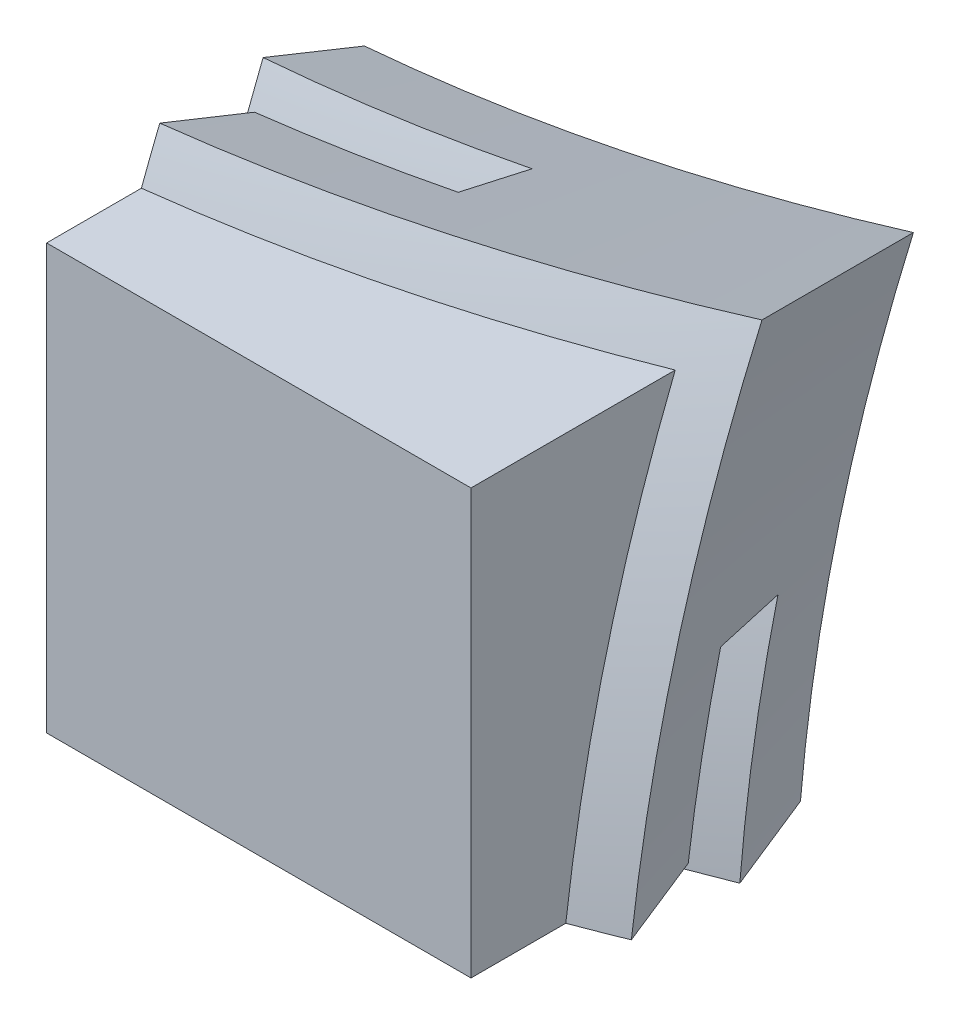
ISO-10303-21;
HEADER;
FILE_DESCRIPTION(('STEP AP214'),'2;1');
FILE_NAME('part.step','',(''),(''),'','','');
FILE_SCHEMA(('AUTOMOTIVE_DESIGN { 1 0 10303 214 1 1 1 1 }'));
ENDSEC;
DATA;
#1=APPLICATION_CONTEXT('core data for automotive mechanical design processes');
#2=APPLICATION_PROTOCOL_DEFINITION('international standard','automotive_design',2000,#1);
#3=PRODUCT_CONTEXT('',#1,'mechanical');
#4=PRODUCT('Part','Part','',(#3));
#5=PRODUCT_RELATED_PRODUCT_CATEGORY('part','',(#4));
#6=PRODUCT_DEFINITION_FORMATION('','',#4);
#7=PRODUCT_DEFINITION_CONTEXT('part definition',#1,'design');
#8=PRODUCT_DEFINITION('design','',#6,#7);
#9=PRODUCT_DEFINITION_SHAPE('','',#8);
#10=(LENGTH_UNIT() NAMED_UNIT(*) SI_UNIT(.MILLI.,.METRE.));
#11=(NAMED_UNIT(*) PLANE_ANGLE_UNIT() SI_UNIT($,.RADIAN.));
#12=(NAMED_UNIT(*) SI_UNIT($,.STERADIAN.) SOLID_ANGLE_UNIT());
#13=UNCERTAINTY_MEASURE_WITH_UNIT(LENGTH_MEASURE(1.E-05),#10,'distance_accuracy_value','');
#14=(GEOMETRIC_REPRESENTATION_CONTEXT(3) GLOBAL_UNCERTAINTY_ASSIGNED_CONTEXT((#13)) GLOBAL_UNIT_ASSIGNED_CONTEXT((#10,
#11,#12)) REPRESENTATION_CONTEXT('',''));
#15=CARTESIAN_POINT('',(0.,0.,0.));
#16=DIRECTION('',(0.,0.,1.));
#17=DIRECTION('',(1.,0.,0.));
#18=AXIS2_PLACEMENT_3D('',#15,#16,#17);
#19=CARTESIAN_POINT('',(11.6999999999999,32.5000000000001,0.));
#20=DIRECTION('',(-1.,0.,0.));
#21=DIRECTION('',(0.,0.,-1.));
#22=AXIS2_PLACEMENT_3D('',#19,#20,#21);
#23=PLANE('',#22);
#24=DIRECTION('',(0.,0.,-1.));
#25=VECTOR('',#24,1.);
#26=CARTESIAN_POINT('',(11.7,3.90000000000005,0.));
#27=LINE('',#26,#25);
#28=CARTESIAN_POINT('',(11.7,3.90000000000005,33.));
#29=VERTEX_POINT('',#28);
#30=CARTESIAN_POINT('',(11.7,3.90000000000005,31.2576390663147));
#31=VERTEX_POINT('',#30);
#32=EDGE_CURVE('E132',#29,#31,#27,.T.);
#33=ORIENTED_EDGE('',*,*,#32,.T.);
#34=CARTESIAN_POINT('',(11.7000000000001,0.,0.));
#35=DIRECTION('',(1.,0.,0.));
#36=DIRECTION('',(0.,0.,-1.));
#37=AXIS2_PLACEMENT_3D('',#34,#35,#36);
#38=CIRCLE('',#37,31.5);
#39=CARTESIAN_POINT('',(11.7,11.7000000000001,29.2465382566895));
#40=VERTEX_POINT('',#39);
#41=EDGE_CURVE('E244',#40,#31,#38,.T.);
#42=ORIENTED_EDGE('',*,*,#41,.F.);
#43=DIRECTION('',(0.,0.,-1.));
#44=VECTOR('',#43,1.);
#45=CARTESIAN_POINT('',(11.7,11.7000000000001,0.));
#46=LINE('',#45,#44);
#47=CARTESIAN_POINT('',(11.7,11.7000000000001,33.));
#48=VERTEX_POINT('',#47);
#49=EDGE_CURVE('E237',#48,#40,#46,.T.);
#50=ORIENTED_EDGE('',*,*,#49,.F.);
#51=DIRECTION('',(0.,1.,0.));
#52=VECTOR('',#51,1.);
#53=CARTESIAN_POINT('',(11.7000000000001,0.,33.));
#54=LINE('',#53,#52);
#55=EDGE_CURVE('E97',#29,#48,#54,.T.);
#56=ORIENTED_EDGE('',*,*,#55,.F.);
#57=EDGE_LOOP('',(#33,#42,#50,#56));
#58=FACE_BOUND('',#57,.T.);
#59=ADVANCED_FACE('F41',(#58),#23,.F.);
#60=CARTESIAN_POINT('',(10.3743688599618,0.,0.));
#61=DIRECTION('',(1.,0.,0.));
#62=DIRECTION('',(0.,0.,1.));
#63=AXIS2_PLACEMENT_3D('',#60,#61,#62);
#64=CONICAL_SURFACE('',#63,25.7275802907014,1.18750065982306);
#65=CARTESIAN_POINT('',(14.6009778131257,2.36043317420627,36.132203640911));
#66=CARTESIAN_POINT('',(13.9616090247387,2.36043317420627,34.5431705104168));
#67=CARTESIAN_POINT('',(13.3223490618145,2.36043317420627,32.9540934847873));
#68=CARTESIAN_POINT('',(12.0443112360116,2.36043317420627,29.7757461717207));
#69=CARTESIAN_POINT('',(11.4055333729816,2.36043317420627,28.1864758843445));
#70=CARTESIAN_POINT('',(10.4479260833091,2.36043317420627,25.8023453920018));
#71=CARTESIAN_POINT('',(10.1288168512602,2.36043317420627,25.0075975856167));
#72=CARTESIAN_POINT('',(9.49085284622169,2.36043317420627,23.4179998864793));
#73=CARTESIAN_POINT('',(9.17199807322086,2.36043317420627,22.6231499937315));
#74=CARTESIAN_POINT('',(8.53462700120133,2.36043317420627,21.0333141768994));
#75=CARTESIAN_POINT('',(8.21611070229252,2.36043317420627,20.238328252771));
#76=CARTESIAN_POINT('',(7.57957409611464,2.36043317420627,18.6481577395725));
#77=CARTESIAN_POINT('',(7.26155378892149,2.36043317420627,17.8529731504719));
#78=CARTESIAN_POINT('',(6.94386023337683,2.36043317420627,17.0576579047928));
#79=B_SPLINE_CURVE_WITH_KNOTS('',3,(#65,#66,#67,#68,#69,#70,#71,#72,#73,#74,#75,#76,#77,#78),
.UNSPECIFIED.,.F.,.F.,(4,2,2,2,2,2,4),(0.,5.13851829557567,10.2770349800929,12.846294176063,
15.415553258566,17.9848131748197,20.5540734842582),.UNSPECIFIED.);
#80=CARTESIAN_POINT('',(11.1223268977222,2.36043317420627,27.4812692217596));
#81=VERTEX_POINT('',#80);
#82=CARTESIAN_POINT('',(10.3743688599618,2.36043317420627,25.6190699059234));
#83=VERTEX_POINT('',#82);
#84=EDGE_CURVE('E95',#81,#83,#79,.T.);
#85=ORIENTED_EDGE('',*,*,#84,.T.);
#86=CARTESIAN_POINT('',(10.3743688599618,0.,0.));
#87=DIRECTION('',(1.,0.,0.));
#88=DIRECTION('',(0.,0.,-1.));
#89=AXIS2_PLACEMENT_3D('',#86,#87,#88);
#90=CIRCLE('',#89,25.7275802907014);
#91=CARTESIAN_POINT('',(10.3743688599618,10.3743688599618,23.543170100306));
#92=VERTEX_POINT('',#91);
#93=EDGE_CURVE('E146',#92,#83,#90,.T.);
#94=ORIENTED_EDGE('',*,*,#93,.F.);
#95=DIRECTION('',(0.373979018880186,0.373979018880187,0.848692751751083));
#96=VECTOR('',#95,1.);
#97=CARTESIAN_POINT('',(0.,0.,0.));
#98=LINE('',#97,#96);
#99=CARTESIAN_POINT('',(12.5666967239637,12.5666967239637,28.5183496523877));
#100=VERTEX_POINT('',#99);
#101=EDGE_CURVE('E249',#100,#92,#98,.F.);
#102=ORIENTED_EDGE('',*,*,#101,.F.);
#103=CARTESIAN_POINT('',(12.5666967239637,0.,0.));
#104=DIRECTION('',(-1.,0.,0.));
#105=DIRECTION('',(0.,-1.,0.));
#106=AXIS2_PLACEMENT_3D('',#103,#104,#105);
#107=CIRCLE('',#106,31.1643728229516);
#108=CARTESIAN_POINT('',(12.5666967239637,3.90000000000005,30.9193811944535));
#109=VERTEX_POINT('',#108);
#110=EDGE_CURVE('E245',#109,#100,#107,.T.);
#111=ORIENTED_EDGE('',*,*,#110,.F.);
#112=CARTESIAN_POINT('',(15.8428159993568,3.90000000000005,39.0948333737115));
#113=CARTESIAN_POINT('',(15.4506243000185,3.90000000000005,38.1173902760603));
#114=CARTESIAN_POINT('',(15.0585491859474,3.90000000000005,37.1399003678757));
#115=CARTESIAN_POINT('',(14.2747158007469,3.90000000000005,35.1847934857351));
#116=CARTESIAN_POINT('',(13.8829575296297,3.90000000000005,34.2071765117744));
#117=CARTESIAN_POINT('',(13.0998428568644,3.90000000000005,32.2517854343566));
#118=CARTESIAN_POINT('',(12.7084864538621,3.90000000000005,31.2740113314421));
#119=CARTESIAN_POINT('',(11.9263012988237,3.90000000000005,29.3182517798619));
#120=CARTESIAN_POINT('',(11.5354725469228,3.90000000000005,28.3402663311421));
#121=CARTESIAN_POINT('',(10.75452449958,3.90000000000005,26.3840077255101));
#122=CARTESIAN_POINT('',(10.3644052069063,3.90000000000005,25.4057345674925));
#123=CARTESIAN_POINT('',(9.58515860199132,3.90000000000005,23.448793878639));
#124=CARTESIAN_POINT('',(9.19603128912186,3.90000000000005,22.4701263480533));
#125=CARTESIAN_POINT('',(8.4192088609626,3.90000000000005,20.5122185395305));
#126=CARTESIAN_POINT('',(8.03151375076951,3.90000000000005,19.5329782595696));
#127=CARTESIAN_POINT('',(7.45162310767204,3.90000000000005,18.063464551947));
#128=CARTESIAN_POINT('',(7.25860136101071,3.90000000000005,17.5735172511564));
#129=CARTESIAN_POINT('',(6.87327397443436,3.90000000000005,16.5933407559649));
#130=CARTESIAN_POINT('',(6.68096833505589,3.90000000000005,16.1031115613531));
#131=CARTESIAN_POINT('',(6.48910354133777,3.90000000000005,15.612709549546));
#132=B_SPLINE_CURVE_WITH_KNOTS('',3,(#112,#113,#114,#115,#116,#117,#118,#119,#120,#121,#122,
#123,#124,#125,#126,#127,#128,#129,#130,#131),.UNSPECIFIED.,.F.,.F.,(4,2,2,2,2,2,2,2,2,4),(0.,
3.15957026715415,6.31914065585586,9.47870036144744,12.6382608762607,15.7978336926141,
18.9574045074345,22.1169865552483,23.6967809107883,25.2765764497666),.UNSPECIFIED.);
#133=CARTESIAN_POINT('',(11.8702849354826,3.90000000000005,29.1778398026732));
#134=VERTEX_POINT('',#133);
#135=EDGE_CURVE('E138',#109,#134,#132,.T.);
#136=ORIENTED_EDGE('',*,*,#135,.T.);
#137=CARTESIAN_POINT('',(11.8702849354826,0.,0.));
#138=DIRECTION('',(-1.,0.,0.));
#139=DIRECTION('',(0.,-1.,0.));
#140=AXIS2_PLACEMENT_3D('',#137,#138,#139);
#141=CIRCLE('',#140,29.4373289472816);
#142=CARTESIAN_POINT('',(11.8702849354826,7.04704306544776,28.5813841439526));
#143=VERTEX_POINT('',#142);
#144=EDGE_CURVE('E126',#134,#143,#141,.T.);
#145=ORIENTED_EDGE('',*,*,#144,.T.);
#146=DIRECTION('',(0.373979018880187,0.222020470944612,0.900470212677213));
#147=VECTOR('',#146,1.);
#148=CARTESIAN_POINT('',(0.,0.,0.));
#149=LINE('',#148,#147);
#150=CARTESIAN_POINT('',(11.1223268977222,6.60300212355853,26.7804437185982));
#151=VERTEX_POINT('',#150);
#152=EDGE_CURVE('E123',#143,#151,#149,.F.);
#153=ORIENTED_EDGE('',*,*,#152,.T.);
#154=CARTESIAN_POINT('',(11.1223268977222,0.,0.));
#155=DIRECTION('',(-1.,0.,0.));
#156=DIRECTION('',(0.,-1.,0.));
#157=AXIS2_PLACEMENT_3D('',#154,#155,#156);
#158=CIRCLE('',#157,27.5824546189915);
#159=EDGE_CURVE('E108',#151,#81,#158,.F.);
#160=ORIENTED_EDGE('',*,*,#159,.T.);
#161=EDGE_LOOP('',(#85,#94,#102,#111,#136,#145,#153,#160));
#162=FACE_BOUND('',#161,.T.);
#163=ADVANCED_FACE('F151',(#162),#64,.F.);
#164=CARTESIAN_POINT('',(32.5,11.7000000000001,0.));
#165=DIRECTION('',(0.,-1.,0.));
#166=DIRECTION('',(0.,0.,-1.));
#167=AXIS2_PLACEMENT_3D('',#164,#165,#166);
#168=PLANE('',#167);
#169=ORIENTED_EDGE('',*,*,#49,.T.);
#170=CARTESIAN_POINT('',(0.,11.7000000000001,0.));
#171=DIRECTION('',(0.,-1.,0.));
#172=DIRECTION('',(0.,0.,-1.));
#173=AXIS2_PLACEMENT_3D('',#170,#171,#172);
#174=CIRCLE('',#173,31.5);
#175=CARTESIAN_POINT('',(3.90000000000001,11.7000000000001,31.2576390663147));
#176=VERTEX_POINT('',#175);
#177=EDGE_CURVE('E45',#40,#176,#174,.T.);
#178=ORIENTED_EDGE('',*,*,#177,.T.);
#179=DIRECTION('',(0.,0.,-1.));
#180=VECTOR('',#179,1.);
#181=CARTESIAN_POINT('',(3.90000000000001,11.7000000000001,0.));
#182=LINE('',#181,#180);
#183=CARTESIAN_POINT('',(3.90000000000001,11.7000000000001,33.));
#184=VERTEX_POINT('',#183);
#185=EDGE_CURVE('E86',#184,#176,#182,.T.);
#186=ORIENTED_EDGE('',*,*,#185,.F.);
#187=DIRECTION('',(-1.,0.,0.));
#188=VECTOR('',#187,1.);
#189=CARTESIAN_POINT('',(0.,11.7000000000001,33.));
#190=LINE('',#189,#188);
#191=EDGE_CURVE('E192',#48,#184,#190,.T.);
#192=ORIENTED_EDGE('',*,*,#191,.F.);
#193=EDGE_LOOP('',(#169,#178,#186,#192));
#194=FACE_BOUND('',#193,.T.);
#195=ADVANCED_FACE('F155',(#194),#168,.F.);
#196=CARTESIAN_POINT('',(0.,10.3743688599618,0.));
#197=DIRECTION('',(0.,1.,0.));
#198=DIRECTION('',(0.,0.,1.));
#199=AXIS2_PLACEMENT_3D('',#196,#197,#198);
#200=CONICAL_SURFACE('',#199,25.7275802907014,1.18750065982306);
#201=ORIENTED_EDGE('',*,*,#101,.T.);
#202=CARTESIAN_POINT('',(0.,10.3743688599618,0.));
#203=DIRECTION('',(0.,-1.,0.));
#204=DIRECTION('',(0.,0.,-1.));
#205=AXIS2_PLACEMENT_3D('',#202,#203,#204);
#206=CIRCLE('',#205,25.7275802907014);
#207=CARTESIAN_POINT('',(2.36043317420623,10.3743688599618,25.6190699059234));
#208=VERTEX_POINT('',#207);
#209=EDGE_CURVE('E246',#92,#208,#206,.T.);
#210=ORIENTED_EDGE('',*,*,#209,.T.);
#211=CARTESIAN_POINT('',(2.36043317420622,14.6293191063566,36.2026372388528));
#212=CARTESIAN_POINT('',(2.36043317420622,13.9827205341,34.5956467423302));
#213=CARTESIAN_POINT('',(2.36043317420622,13.3362313992313,32.9886120995187));
#214=CARTESIAN_POINT('',(2.36043317420623,12.043745667279,29.7743453845298));
#215=CARTESIAN_POINT('',(2.36043317420623,11.397749070035,28.1671133124169));
#216=CARTESIAN_POINT('',(2.36043317420623,10.4293283956294,25.7560342133777));
#217=CARTESIAN_POINT('',(2.36043317420623,10.1066171513813,24.9523025413823));
#218=CARTESIAN_POINT('',(2.36043317420623,9.46145697062428,23.3447339667481));
#219=CARTESIAN_POINT('',(2.36043317420624,9.13900803410302,22.540897064114));
#220=CARTESIAN_POINT('',(2.36043317420624,8.49446037030945,20.933082510354));
#221=CARTESIAN_POINT('',(2.36043317420624,8.17236164315564,20.1291048591804));
#222=CARTESIAN_POINT('',(2.36043317420624,7.52868097580781,18.5209425771274));
#223=CARTESIAN_POINT('',(2.36043317420624,7.207099035698,17.7167579462141));
#224=CARTESIAN_POINT('',(2.36043317420624,6.88585877586769,16.9124367048989));
#225=B_SPLINE_CURVE_WITH_KNOTS('',3,(#211,#212,#213,#214,#215,#216,#217,#218,#219,#220,#221,
#222,#223,#224),.UNSPECIFIED.,.F.,.F.,(4,2,2,2,2,2,4),(0.,5.19659265829749,10.3931836233915,
12.9914800142478,15.5897762829669,18.1880734305124,20.7863710014142),.UNSPECIFIED.);
#226=CARTESIAN_POINT('',(2.36043317420623,11.1223268977222,27.4812692217596));
#227=VERTEX_POINT('',#226);
#228=EDGE_CURVE('E60',#227,#208,#225,.T.);
#229=ORIENTED_EDGE('',*,*,#228,.F.);
#230=CARTESIAN_POINT('',(0.,11.1223268977222,0.));
#231=DIRECTION('',(0.,-1.,0.));
#232=DIRECTION('',(0.,0.,-1.));
#233=AXIS2_PLACEMENT_3D('',#230,#231,#232);
#234=CIRCLE('',#233,27.5824546189915);
#235=CARTESIAN_POINT('',(6.6030021235585,11.1223268977222,26.7804437185982));
#236=VERTEX_POINT('',#235);
#237=EDGE_CURVE('E83',#236,#227,#234,.T.);
#238=ORIENTED_EDGE('',*,*,#237,.F.);
#239=DIRECTION('',(0.222020470944611,0.373979018880187,0.900470212677213));
#240=VECTOR('',#239,1.);
#241=CARTESIAN_POINT('',(0.,0.,0.));
#242=LINE('',#241,#240);
#243=CARTESIAN_POINT('',(7.04704306544776,11.8702849354827,28.5813841439528));
#244=VERTEX_POINT('',#243);
#245=EDGE_CURVE('E313',#244,#236,#242,.F.);
#246=ORIENTED_EDGE('',*,*,#245,.F.);
#247=CARTESIAN_POINT('',(0.,11.8702849354826,0.));
#248=DIRECTION('',(0.,-1.,0.));
#249=DIRECTION('',(0.,0.,-1.));
#250=AXIS2_PLACEMENT_3D('',#247,#248,#249);
#251=CIRCLE('',#250,29.4373289472816);
#252=CARTESIAN_POINT('',(3.90000000000001,11.8702849354826,29.1778398026732));
#253=VERTEX_POINT('',#252);
#254=EDGE_CURVE('E191',#253,#244,#251,.F.);
#255=ORIENTED_EDGE('',*,*,#254,.F.);
#256=CARTESIAN_POINT('',(3.9,14.6553057929213,36.1340946350971));
#257=CARTESIAN_POINT('',(3.9,14.1745051483331,34.9347775726133));
#258=CARTESIAN_POINT('',(3.9,13.693911618071,33.735377351445));
#259=CARTESIAN_POINT('',(3.90000000000001,12.7333811666766,31.3363149750223));
#260=CARTESIAN_POINT('',(3.90000000000001,12.253444245105,30.1366528199436));
#261=CARTESIAN_POINT('',(3.90000000000001,11.2944685350175,27.7369688225792));
#262=CARTESIAN_POINT('',(3.90000000000001,10.8154297468989,26.5369469801344));
#263=CARTESIAN_POINT('',(3.90000000000002,10.0978759325235,24.73651342545));
#264=CARTESIAN_POINT('',(3.90000000000002,9.85885864278769,24.1363019083987));
#265=CARTESIAN_POINT('',(3.90000000000002,9.38124797848187,22.9357101309314));
#266=CARTESIAN_POINT('',(3.90000000000002,9.142654603983,22.3353298704872));
#267=CARTESIAN_POINT('',(3.90000000000002,8.90431776335434,21.7348476992113));
#268=B_SPLINE_CURVE_WITH_KNOTS('',3,(#256,#257,#258,#259,#260,#261,#262,#263,#264,#265,#266,
#267),.UNSPECIFIED.,.F.,.F.,(4,2,2,2,2,4),(0.,3.87630974583269,7.75261689652987,
11.6289257621041,13.5670814881771,15.5052375394472),.UNSPECIFIED.);
#269=CARTESIAN_POINT('',(3.90000000000001,12.5666967239637,30.9193811944535));
#270=VERTEX_POINT('',#269);
#271=EDGE_CURVE('E183',#270,#253,#268,.T.);
#272=ORIENTED_EDGE('',*,*,#271,.F.);
#273=CARTESIAN_POINT('',(0.,12.5666967239637,0.));
#274=DIRECTION('',(0.,-1.,0.));
#275=DIRECTION('',(0.,0.,-1.));
#276=AXIS2_PLACEMENT_3D('',#273,#274,#275);
#277=CIRCLE('',#276,31.1643728229516);
#278=EDGE_CURVE('E251',#100,#270,#277,.T.);
#279=ORIENTED_EDGE('',*,*,#278,.F.);
#280=EDGE_LOOP('',(#201,#210,#229,#238,#246,#255,#272,#279));
#281=FACE_BOUND('',#280,.T.);
#282=ADVANCED_FACE('F165',(#281),#200,.F.);
#283=CARTESIAN_POINT('',(0.,0.,0.));
#284=DIRECTION('',(0.,-1.,0.));
#285=DIRECTION('',(1.,0.,0.));
#286=AXIS2_PLACEMENT_3D('',#283,#284,#285);
#287=SPHERICAL_SURFACE('',#286,33.6026784646701);
#288=ORIENTED_EDGE('',*,*,#278,.T.);
#289=CARTESIAN_POINT('',(3.90000000000005,0.,0.));
#290=DIRECTION('',(-1.,0.,0.));
#291=DIRECTION('',(0.,-1.,0.));
#292=AXIS2_PLACEMENT_3D('',#289,#290,#291);
#293=CIRCLE('',#292,33.3755898824276);
#294=EDGE_CURVE('E315',#176,#270,#293,.T.);
#295=ORIENTED_EDGE('',*,*,#294,.F.);
#296=ORIENTED_EDGE('',*,*,#177,.F.);
#297=ORIENTED_EDGE('',*,*,#41,.T.);
#298=CARTESIAN_POINT('',(0.,3.90000000000005,0.));
#299=DIRECTION('',(0.,-1.,0.));
#300=DIRECTION('',(0.,0.,-1.));
#301=AXIS2_PLACEMENT_3D('',#298,#299,#300);
#302=CIRCLE('',#301,33.3755898824276);
#303=EDGE_CURVE('E135',#31,#109,#302,.F.);
#304=ORIENTED_EDGE('',*,*,#303,.T.);
#305=ORIENTED_EDGE('',*,*,#110,.T.);
#306=EDGE_LOOP('',(#288,#295,#296,#297,#304,#305));
#307=FACE_BOUND('',#306,.T.);
#308=ADVANCED_FACE('F161',(#307),#287,.T.);
#309=CARTESIAN_POINT('',(0.,0.,0.));
#310=DIRECTION('',(0.,-1.,0.));
#311=DIRECTION('',(1.,0.,0.));
#312=AXIS2_PLACEMENT_3D('',#309,#310,#311);
#313=SPHERICAL_SURFACE('',#312,27.7405103928719);
#314=ORIENTED_EDGE('',*,*,#93,.T.);
#315=CARTESIAN_POINT('',(0.,2.36043317420627,0.));
#316=DIRECTION('',(0.,-1.,0.));
#317=DIRECTION('',(0.,0.,-1.));
#318=AXIS2_PLACEMENT_3D('',#315,#316,#317);
#319=CIRCLE('',#318,27.6399036193533);
#320=CARTESIAN_POINT('',(2.36043317420626,2.36043317420627,27.5389293059343));
#321=VERTEX_POINT('',#320);
#322=EDGE_CURVE('E103',#83,#321,#319,.T.);
#323=ORIENTED_EDGE('',*,*,#322,.T.);
#324=CARTESIAN_POINT('',(2.36043317420627,0.,0.));
#325=DIRECTION('',(-1.,0.,0.));
#326=DIRECTION('',(0.,-1.,0.));
#327=AXIS2_PLACEMENT_3D('',#324,#325,#326);
#328=CIRCLE('',#327,27.6399036193533);
#329=EDGE_CURVE('E101',#208,#321,#328,.F.);
#330=ORIENTED_EDGE('',*,*,#329,.F.);
#331=ORIENTED_EDGE('',*,*,#209,.F.);
#332=EDGE_LOOP('',(#314,#323,#330,#331));
#333=FACE_BOUND('',#332,.T.);
#334=ADVANCED_FACE('F157',(#333),#313,.F.);
#335=CARTESIAN_POINT('',(32.5000000000001,3.90000000000005,0.));
#336=DIRECTION('',(0.,-1.,0.));
#337=DIRECTION('',(0.,0.,-1.));
#338=AXIS2_PLACEMENT_3D('',#335,#336,#337);
#339=PLANE('',#338);
#340=ORIENTED_EDGE('',*,*,#32,.F.);
#341=DIRECTION('',(-1.,0.,0.));
#342=VECTOR('',#341,1.);
#343=CARTESIAN_POINT('',(0.,3.90000000000005,33.));
#344=LINE('',#343,#342);
#345=CARTESIAN_POINT('',(3.90000000000004,3.90000000000005,33.));
#346=VERTEX_POINT('',#345);
#347=EDGE_CURVE('E105',#29,#346,#344,.T.);
#348=ORIENTED_EDGE('',*,*,#347,.T.);
#349=DIRECTION('',(0.,0.,-1.));
#350=VECTOR('',#349,1.);
#351=CARTESIAN_POINT('',(3.90000000000004,3.90000000000005,0.));
#352=LINE('',#351,#350);
#353=CARTESIAN_POINT('',(3.90000000000004,3.90000000000005,31.2576390663147));
#354=VERTEX_POINT('',#353);
#355=EDGE_CURVE('E129',#346,#354,#352,.T.);
#356=ORIENTED_EDGE('',*,*,#355,.T.);
#357=CARTESIAN_POINT('',(0.,3.90000000000005,0.));
#358=DIRECTION('',(0.,-1.,0.));
#359=DIRECTION('',(0.,0.,-1.));
#360=AXIS2_PLACEMENT_3D('',#357,#358,#359);
#361=CIRCLE('',#360,31.5000000000001);
#362=EDGE_CURVE('E262',#134,#354,#361,.T.);
#363=ORIENTED_EDGE('',*,*,#362,.F.);
#364=ORIENTED_EDGE('',*,*,#135,.F.);
#365=ORIENTED_EDGE('',*,*,#303,.F.);
#366=EDGE_LOOP('',(#340,#348,#356,#363,#364,#365));
#367=FACE_BOUND('',#366,.T.);
#368=ADVANCED_FACE('F148',(#367),#339,.T.);
#369=CARTESIAN_POINT('',(3.89999999999994,32.5000000000001,0.));
#370=DIRECTION('',(-1.,0.,0.));
#371=DIRECTION('',(0.,0.,-1.));
#372=AXIS2_PLACEMENT_3D('',#369,#370,#371);
#373=PLANE('',#372);
#374=ORIENTED_EDGE('',*,*,#355,.F.);
#375=DIRECTION('',(0.,1.,0.));
#376=VECTOR('',#375,1.);
#377=CARTESIAN_POINT('',(3.90000000000005,0.,33.));
#378=LINE('',#377,#376);
#379=EDGE_CURVE('E241',#346,#184,#378,.T.);
#380=ORIENTED_EDGE('',*,*,#379,.T.);
#381=ORIENTED_EDGE('',*,*,#185,.T.);
#382=ORIENTED_EDGE('',*,*,#294,.T.);
#383=ORIENTED_EDGE('',*,*,#271,.T.);
#384=CARTESIAN_POINT('',(3.90000000000005,0.,0.));
#385=DIRECTION('',(1.,0.,0.));
#386=DIRECTION('',(0.,0.,-1.));
#387=AXIS2_PLACEMENT_3D('',#384,#385,#386);
#388=CIRCLE('',#387,31.5000000000001);
#389=EDGE_CURVE('E11',#253,#354,#388,.T.);
#390=ORIENTED_EDGE('',*,*,#389,.T.);
#391=EDGE_LOOP('',(#374,#380,#381,#382,#383,#390));
#392=FACE_BOUND('',#391,.T.);
#393=ADVANCED_FACE('F194',(#392),#373,.T.);
#394=CARTESIAN_POINT('',(0.,0.,0.));
#395=DIRECTION('',(0.,-1.,0.));
#396=DIRECTION('',(1.,0.,0.));
#397=AXIS2_PLACEMENT_3D('',#394,#395,#396);
#398=SPHERICAL_SURFACE('',#397,31.7405103928719);
#399=ORIENTED_EDGE('',*,*,#362,.T.);
#400=ORIENTED_EDGE('',*,*,#389,.F.);
#401=ORIENTED_EDGE('',*,*,#254,.T.);
#402=CARTESIAN_POINT('',(7.04704306544776,0.,0.));
#403=DIRECTION('',(1.,0.,0.));
#404=DIRECTION('',(0.,0.,-1.));
#405=AXIS2_PLACEMENT_3D('',#402,#403,#404);
#406=CIRCLE('',#405,30.9483308763773);
#407=CARTESIAN_POINT('',(7.04704306544773,7.04704306544776,30.1353342119754));
#408=VERTEX_POINT('',#407);
#409=EDGE_CURVE('E51',#244,#408,#406,.T.);
#410=ORIENTED_EDGE('',*,*,#409,.T.);
#411=CARTESIAN_POINT('',(0.,7.04704306544776,0.));
#412=DIRECTION('',(0.,-1.,0.));
#413=DIRECTION('',(0.,0.,-1.));
#414=AXIS2_PLACEMENT_3D('',#411,#412,#413);
#415=CIRCLE('',#414,30.9483308763773);
#416=EDGE_CURVE('E265',#143,#408,#415,.T.);
#417=ORIENTED_EDGE('',*,*,#416,.F.);
#418=ORIENTED_EDGE('',*,*,#144,.F.);
#419=EDGE_LOOP('',(#399,#400,#401,#410,#417,#418));
#420=FACE_BOUND('',#419,.T.);
#421=ADVANCED_FACE('F198',(#420),#398,.F.);
#422=CARTESIAN_POINT('',(0.,6.60300212355853,0.));
#423=DIRECTION('',(0.,1.,0.));
#424=DIRECTION('',(0.,0.,1.));
#425=AXIS2_PLACEMENT_3D('',#422,#423,#424);
#426=CONICAL_SURFACE('',#425,28.9982468674367,1.34691015484274);
#427=ORIENTED_EDGE('',*,*,#416,.T.);
#428=DIRECTION('',(0.222020470944611,0.222020470944612,0.949428154713702));
#429=VECTOR('',#428,1.);
#430=CARTESIAN_POINT('',(0.,0.,0.));
#431=LINE('',#430,#429);
#432=CARTESIAN_POINT('',(6.60300212355851,6.60300212355853,28.236477902548));
#433=VERTEX_POINT('',#432);
#434=EDGE_CURVE('E120',#408,#433,#431,.F.);
#435=ORIENTED_EDGE('',*,*,#434,.T.);
#436=CARTESIAN_POINT('',(0.,6.60300212355853,0.));
#437=DIRECTION('',(0.,-1.,0.));
#438=DIRECTION('',(0.,0.,-1.));
#439=AXIS2_PLACEMENT_3D('',#436,#437,#438);
#440=CIRCLE('',#439,28.9982468674367);
#441=EDGE_CURVE('E96',#151,#433,#440,.T.);
#442=ORIENTED_EDGE('',*,*,#441,.F.);
#443=ORIENTED_EDGE('',*,*,#152,.F.);
#444=EDGE_LOOP('',(#427,#435,#442,#443));
#445=FACE_BOUND('',#444,.T.);
#446=ADVANCED_FACE('F202',(#445),#426,.T.);
#447=CARTESIAN_POINT('',(27.6399036193533,2.36043317420627,0.));
#448=DIRECTION('',(0.,-1.,0.));
#449=DIRECTION('',(0.,0.,-1.));
#450=AXIS2_PLACEMENT_3D('',#447,#448,#449);
#451=PLANE('',#450);
#452=ORIENTED_EDGE('',*,*,#84,.F.);
#453=CARTESIAN_POINT('',(0.,2.36043317420627,0.));
#454=DIRECTION('',(0.,-1.,0.));
#455=DIRECTION('',(0.,0.,-1.));
#456=AXIS2_PLACEMENT_3D('',#453,#454,#455);
#457=CIRCLE('',#456,29.6466914453978);
#458=CARTESIAN_POINT('',(2.36043317420626,2.36043317420627,29.5525746575274));
#459=VERTEX_POINT('',#458);
#460=EDGE_CURVE('E79',#81,#459,#457,.T.);
#461=ORIENTED_EDGE('',*,*,#460,.T.);
#462=DIRECTION('',(0.,0.,-1.));
#463=VECTOR('',#462,1.);
#464=CARTESIAN_POINT('',(2.36043317420626,2.36043317420627,0.));
#465=LINE('',#464,#463);
#466=EDGE_CURVE('E94',#459,#321,#465,.T.);
#467=ORIENTED_EDGE('',*,*,#466,.T.);
#468=ORIENTED_EDGE('',*,*,#322,.F.);
#469=EDGE_LOOP('',(#452,#461,#467,#468));
#470=FACE_BOUND('',#469,.T.);
#471=ADVANCED_FACE('F91',(#470),#451,.T.);
#472=CARTESIAN_POINT('',(0.,0.,0.));
#473=DIRECTION('',(0.,-1.,0.));
#474=DIRECTION('',(1.,0.,0.));
#475=AXIS2_PLACEMENT_3D('',#472,#473,#474);
#476=SPHERICAL_SURFACE('',#475,29.7405103928719);
#477=ORIENTED_EDGE('',*,*,#159,.F.);
#478=ORIENTED_EDGE('',*,*,#441,.T.);
#479=CARTESIAN_POINT('',(6.60300212355853,0.,0.));
#480=DIRECTION('',(1.,0.,0.));
#481=DIRECTION('',(0.,0.,-1.));
#482=AXIS2_PLACEMENT_3D('',#479,#480,#481);
#483=CIRCLE('',#482,28.9982468674367);
#484=EDGE_CURVE('E85',#236,#433,#483,.T.);
#485=ORIENTED_EDGE('',*,*,#484,.F.);
#486=ORIENTED_EDGE('',*,*,#237,.T.);
#487=CARTESIAN_POINT('',(2.36043317420627,0.,0.));
#488=DIRECTION('',(1.,0.,0.));
#489=DIRECTION('',(0.,0.,-1.));
#490=AXIS2_PLACEMENT_3D('',#487,#488,#489);
#491=CIRCLE('',#490,29.6466914453978);
#492=EDGE_CURVE('E74',#227,#459,#491,.T.);
#493=ORIENTED_EDGE('',*,*,#492,.T.);
#494=ORIENTED_EDGE('',*,*,#460,.F.);
#495=EDGE_LOOP('',(#477,#478,#485,#486,#493,#494));
#496=FACE_BOUND('',#495,.T.);
#497=ADVANCED_FACE('F77',(#496),#476,.T.);
#498=CARTESIAN_POINT('',(6.60300212355853,0.,0.));
#499=DIRECTION('',(1.,0.,0.));
#500=DIRECTION('',(0.,0.,1.));
#501=AXIS2_PLACEMENT_3D('',#498,#499,#500);
#502=CONICAL_SURFACE('',#501,28.9982468674367,1.34691015484274);
#503=ORIENTED_EDGE('',*,*,#434,.F.);
#504=ORIENTED_EDGE('',*,*,#409,.F.);
#505=ORIENTED_EDGE('',*,*,#245,.T.);
#506=ORIENTED_EDGE('',*,*,#484,.T.);
#507=EDGE_LOOP('',(#503,#504,#505,#506));
#508=FACE_BOUND('',#507,.T.);
#509=ADVANCED_FACE('F206',(#508),#502,.T.);
#510=CARTESIAN_POINT('',(2.36043317420617,27.6399036193533,0.));
#511=DIRECTION('',(-1.,0.,0.));
#512=DIRECTION('',(0.,0.,-1.));
#513=AXIS2_PLACEMENT_3D('',#510,#511,#512);
#514=PLANE('',#513);
#515=ORIENTED_EDGE('',*,*,#466,.F.);
#516=ORIENTED_EDGE('',*,*,#492,.F.);
#517=ORIENTED_EDGE('',*,*,#228,.T.);
#518=ORIENTED_EDGE('',*,*,#329,.T.);
#519=EDGE_LOOP('',(#515,#516,#517,#518));
#520=FACE_BOUND('',#519,.T.);
#521=ADVANCED_FACE('F99',(#520),#514,.T.);
#522=CARTESIAN_POINT('',(0.,0.,33.));
#523=DIRECTION('',(0.,0.,-1.));
#524=DIRECTION('',(-1.,0.,0.));
#525=AXIS2_PLACEMENT_3D('',#522,#523,#524);
#526=PLANE('',#525);
#527=ORIENTED_EDGE('',*,*,#55,.T.);
#528=ORIENTED_EDGE('',*,*,#191,.T.);
#529=ORIENTED_EDGE('',*,*,#379,.F.);
#530=ORIENTED_EDGE('',*,*,#347,.F.);
#531=EDGE_LOOP('',(#527,#528,#529,#530));
#532=FACE_BOUND('',#531,.T.);
#533=ADVANCED_FACE('F43',(#532),#526,.F.);
#534=CLOSED_SHELL('',(#59,#163,#195,#282,#308,#334,#368,#393,#421,#446,#471,#497,#509,#521,#533));
#535=MANIFOLD_SOLID_BREP('B2',#534);
#536=ADVANCED_BREP_SHAPE_REPRESENTATION('',(#18,#535),#14);
#537=SHAPE_DEFINITION_REPRESENTATION(#9,#536);
ENDSEC;
END-ISO-10303-21;
